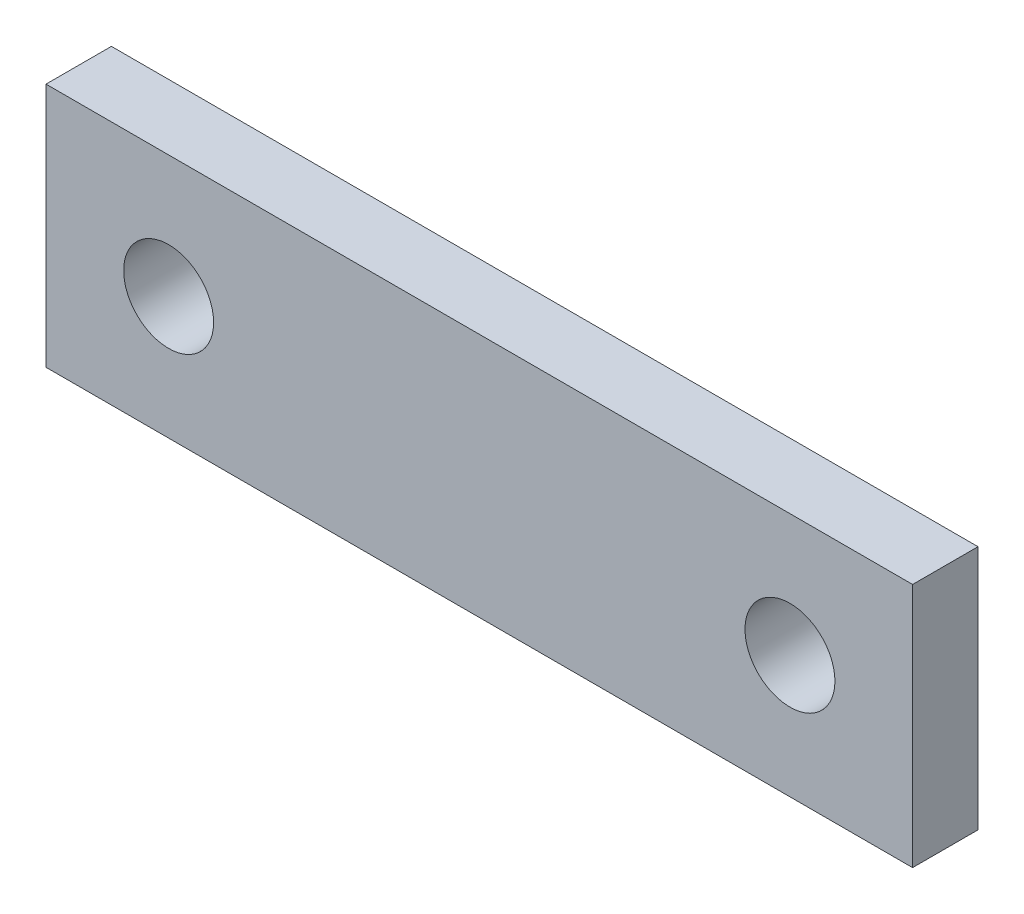
ISO-10303-21;
HEADER;
FILE_DESCRIPTION(('STEP AP214'),'2;1');
FILE_NAME('part.step','',(''),(''),'','','');
FILE_SCHEMA(('AUTOMOTIVE_DESIGN { 1 0 10303 214 1 1 1 1 }'));
ENDSEC;
DATA;
#1=APPLICATION_CONTEXT('core data for automotive mechanical design processes');
#2=APPLICATION_PROTOCOL_DEFINITION('international standard','automotive_design',2000,#1);
#3=PRODUCT_CONTEXT('',#1,'mechanical');
#4=PRODUCT('Part','Part','',(#3));
#5=PRODUCT_RELATED_PRODUCT_CATEGORY('part','',(#4));
#6=PRODUCT_DEFINITION_FORMATION('','',#4);
#7=PRODUCT_DEFINITION_CONTEXT('part definition',#1,'design');
#8=PRODUCT_DEFINITION('design','',#6,#7);
#9=PRODUCT_DEFINITION_SHAPE('','',#8);
#10=(LENGTH_UNIT() NAMED_UNIT(*) SI_UNIT(.MILLI.,.METRE.));
#11=(NAMED_UNIT(*) PLANE_ANGLE_UNIT() SI_UNIT($,.RADIAN.));
#12=(NAMED_UNIT(*) SI_UNIT($,.STERADIAN.) SOLID_ANGLE_UNIT());
#13=UNCERTAINTY_MEASURE_WITH_UNIT(LENGTH_MEASURE(1.E-05),#10,'distance_accuracy_value','');
#14=(GEOMETRIC_REPRESENTATION_CONTEXT(3) GLOBAL_UNCERTAINTY_ASSIGNED_CONTEXT((#13)) GLOBAL_UNIT_ASSIGNED_CONTEXT((#10,
#11,#12)) REPRESENTATION_CONTEXT('',''));
#15=CARTESIAN_POINT('',(0.,0.,0.));
#16=DIRECTION('',(0.,0.,1.));
#17=DIRECTION('',(1.,0.,0.));
#18=AXIS2_PLACEMENT_3D('',#15,#16,#17);
#19=CARTESIAN_POINT('',(0.,0.,16.));
#20=DIRECTION('',(1.,0.,0.));
#21=DIRECTION('',(0.,0.,-1.));
#22=AXIS2_PLACEMENT_3D('',#19,#20,#21);
#23=PLANE('',#22);
#24=DIRECTION('',(0.,-1.,0.));
#25=VECTOR('',#24,1.);
#26=CARTESIAN_POINT('',(0.,0.,0.));
#27=LINE('',#26,#25);
#28=CARTESIAN_POINT('',(0.,60.,0.));
#29=VERTEX_POINT('',#28);
#30=CARTESIAN_POINT('',(0.,0.,0.));
#31=VERTEX_POINT('',#30);
#32=EDGE_CURVE('E95',#29,#31,#27,.T.);
#33=ORIENTED_EDGE('',*,*,#32,.T.);
#34=DIRECTION('',(0.,0.,-1.));
#35=VECTOR('',#34,1.);
#36=CARTESIAN_POINT('',(0.,0.,16.));
#37=LINE('',#36,#35);
#38=CARTESIAN_POINT('',(0.,0.,16.));
#39=VERTEX_POINT('',#38);
#40=EDGE_CURVE('E11',#39,#31,#37,.T.);
#41=ORIENTED_EDGE('',*,*,#40,.F.);
#42=DIRECTION('',(0.,-1.,0.));
#43=VECTOR('',#42,1.);
#44=CARTESIAN_POINT('',(0.,0.,16.));
#45=LINE('',#44,#43);
#46=CARTESIAN_POINT('',(0.,60.,16.));
#47=VERTEX_POINT('',#46);
#48=EDGE_CURVE('E83',#47,#39,#45,.T.);
#49=ORIENTED_EDGE('',*,*,#48,.F.);
#50=DIRECTION('',(0.,0.,-1.));
#51=VECTOR('',#50,1.);
#52=CARTESIAN_POINT('',(0.,60.,16.));
#53=LINE('',#52,#51);
#54=EDGE_CURVE('E91',#47,#29,#53,.T.);
#55=ORIENTED_EDGE('',*,*,#54,.T.);
#56=EDGE_LOOP('',(#33,#41,#49,#55));
#57=FACE_BOUND('',#56,.T.);
#58=ADVANCED_FACE('F32',(#57),#23,.F.);
#59=CARTESIAN_POINT('',(0.,0.,16.));
#60=DIRECTION('',(0.,1.,0.));
#61=DIRECTION('',(0.,0.,1.));
#62=AXIS2_PLACEMENT_3D('',#59,#60,#61);
#63=PLANE('',#62);
#64=DIRECTION('',(1.,0.,0.));
#65=VECTOR('',#64,1.);
#66=CARTESIAN_POINT('',(0.,0.,0.));
#67=LINE('',#66,#65);
#68=CARTESIAN_POINT('',(212.,0.,0.));
#69=VERTEX_POINT('',#68);
#70=EDGE_CURVE('E87',#31,#69,#67,.T.);
#71=ORIENTED_EDGE('',*,*,#70,.T.);
#72=DIRECTION('',(0.,0.,-1.));
#73=VECTOR('',#72,1.);
#74=CARTESIAN_POINT('',(212.,0.,16.));
#75=LINE('',#74,#73);
#76=CARTESIAN_POINT('',(212.,0.,16.));
#77=VERTEX_POINT('',#76);
#78=EDGE_CURVE('E40',#77,#69,#75,.T.);
#79=ORIENTED_EDGE('',*,*,#78,.F.);
#80=DIRECTION('',(1.,0.,0.));
#81=VECTOR('',#80,1.);
#82=CARTESIAN_POINT('',(0.,0.,16.));
#83=LINE('',#82,#81);
#84=EDGE_CURVE('E78',#39,#77,#83,.T.);
#85=ORIENTED_EDGE('',*,*,#84,.F.);
#86=ORIENTED_EDGE('',*,*,#40,.T.);
#87=EDGE_LOOP('',(#71,#79,#85,#86));
#88=FACE_BOUND('',#87,.T.);
#89=ADVANCED_FACE('F86',(#88),#63,.F.);
#90=CARTESIAN_POINT('',(212.,0.,16.));
#91=DIRECTION('',(-1.,0.,0.));
#92=DIRECTION('',(0.,0.,1.));
#93=AXIS2_PLACEMENT_3D('',#90,#91,#92);
#94=PLANE('',#93);
#95=DIRECTION('',(0.,1.,0.));
#96=VECTOR('',#95,1.);
#97=CARTESIAN_POINT('',(212.,0.,0.));
#98=LINE('',#97,#96);
#99=CARTESIAN_POINT('',(212.,60.,0.));
#100=VERTEX_POINT('',#99);
#101=EDGE_CURVE('E65',#69,#100,#98,.T.);
#102=ORIENTED_EDGE('',*,*,#101,.T.);
#103=DIRECTION('',(0.,0.,-1.));
#104=VECTOR('',#103,1.);
#105=CARTESIAN_POINT('',(212.,60.,16.));
#106=LINE('',#105,#104);
#107=CARTESIAN_POINT('',(212.,60.,16.));
#108=VERTEX_POINT('',#107);
#109=EDGE_CURVE('E88',#108,#100,#106,.T.);
#110=ORIENTED_EDGE('',*,*,#109,.F.);
#111=DIRECTION('',(0.,1.,0.));
#112=VECTOR('',#111,1.);
#113=CARTESIAN_POINT('',(212.,0.,16.));
#114=LINE('',#113,#112);
#115=EDGE_CURVE('E81',#77,#108,#114,.T.);
#116=ORIENTED_EDGE('',*,*,#115,.F.);
#117=ORIENTED_EDGE('',*,*,#78,.T.);
#118=EDGE_LOOP('',(#102,#110,#116,#117));
#119=FACE_BOUND('',#118,.T.);
#120=ADVANCED_FACE('F89',(#119),#94,.F.);
#121=CARTESIAN_POINT('',(0.,60.,16.));
#122=DIRECTION('',(0.,-1.,0.));
#123=DIRECTION('',(0.,0.,-1.));
#124=AXIS2_PLACEMENT_3D('',#121,#122,#123);
#125=PLANE('',#124);
#126=DIRECTION('',(-1.,0.,0.));
#127=VECTOR('',#126,1.);
#128=CARTESIAN_POINT('',(0.,60.,0.));
#129=LINE('',#128,#127);
#130=EDGE_CURVE('E71',#100,#29,#129,.T.);
#131=ORIENTED_EDGE('',*,*,#130,.T.);
#132=ORIENTED_EDGE('',*,*,#54,.F.);
#133=DIRECTION('',(-1.,0.,0.));
#134=VECTOR('',#133,1.);
#135=CARTESIAN_POINT('',(0.,60.,16.));
#136=LINE('',#135,#134);
#137=EDGE_CURVE('E48',#108,#47,#136,.T.);
#138=ORIENTED_EDGE('',*,*,#137,.F.);
#139=ORIENTED_EDGE('',*,*,#109,.T.);
#140=EDGE_LOOP('',(#131,#132,#138,#139));
#141=FACE_BOUND('',#140,.T.);
#142=ADVANCED_FACE('F103',(#141),#125,.F.);
#143=CARTESIAN_POINT('',(0.,60.,16.));
#144=DIRECTION('',(0.,0.,-1.));
#145=DIRECTION('',(-1.,0.,0.));
#146=AXIS2_PLACEMENT_3D('',#143,#144,#145);
#147=PLANE('',#146);
#148=CARTESIAN_POINT('',(182.,30.,16.));
#149=DIRECTION('',(0.,0.,1.));
#150=DIRECTION('',(1.,0.,0.));
#151=AXIS2_PLACEMENT_3D('',#148,#149,#150);
#152=CIRCLE('',#151,11.);
#153=CARTESIAN_POINT('',(193.,30.,16.));
#154=VERTEX_POINT('',#153);
#155=EDGE_CURVE('E115',#154,#154,#152,.T.);
#156=ORIENTED_EDGE('',*,*,#155,.F.);
#157=EDGE_LOOP('',(#156));
#158=FACE_BOUND('',#157,.T.);
#159=CARTESIAN_POINT('',(30.,30.,16.));
#160=DIRECTION('',(0.,0.,1.));
#161=DIRECTION('',(1.,0.,0.));
#162=AXIS2_PLACEMENT_3D('',#159,#160,#161);
#163=CIRCLE('',#162,11.);
#164=CARTESIAN_POINT('',(41.,30.,16.));
#165=VERTEX_POINT('',#164);
#166=EDGE_CURVE('E109',#165,#165,#163,.T.);
#167=ORIENTED_EDGE('',*,*,#166,.F.);
#168=EDGE_LOOP('',(#167));
#169=FACE_BOUND('',#168,.T.);
#170=ORIENTED_EDGE('',*,*,#48,.T.);
#171=ORIENTED_EDGE('',*,*,#84,.T.);
#172=ORIENTED_EDGE('',*,*,#115,.T.);
#173=ORIENTED_EDGE('',*,*,#137,.T.);
#174=EDGE_LOOP('',(#170,#171,#172,#173));
#175=FACE_BOUND('',#174,.T.);
#176=ADVANCED_FACE('F79',(#158,#169,#175),#147,.F.);
#177=CARTESIAN_POINT('',(0.,60.,0.));
#178=DIRECTION('',(0.,0.,-1.));
#179=DIRECTION('',(-1.,0.,0.));
#180=AXIS2_PLACEMENT_3D('',#177,#178,#179);
#181=PLANE('',#180);
#182=CARTESIAN_POINT('',(182.,30.,0.));
#183=DIRECTION('',(0.,0.,1.));
#184=DIRECTION('',(1.,0.,0.));
#185=AXIS2_PLACEMENT_3D('',#182,#183,#184);
#186=CIRCLE('',#185,11.);
#187=CARTESIAN_POINT('',(193.,30.,0.));
#188=VERTEX_POINT('',#187);
#189=EDGE_CURVE('E112',#188,#188,#186,.T.);
#190=ORIENTED_EDGE('',*,*,#189,.T.);
#191=EDGE_LOOP('',(#190));
#192=FACE_BOUND('',#191,.T.);
#193=CARTESIAN_POINT('',(30.,30.,0.));
#194=DIRECTION('',(0.,0.,1.));
#195=DIRECTION('',(1.,0.,0.));
#196=AXIS2_PLACEMENT_3D('',#193,#194,#195);
#197=CIRCLE('',#196,11.);
#198=CARTESIAN_POINT('',(41.,30.,0.));
#199=VERTEX_POINT('',#198);
#200=EDGE_CURVE('E98',#199,#199,#197,.T.);
#201=ORIENTED_EDGE('',*,*,#200,.T.);
#202=EDGE_LOOP('',(#201));
#203=FACE_BOUND('',#202,.T.);
#204=ORIENTED_EDGE('',*,*,#32,.F.);
#205=ORIENTED_EDGE('',*,*,#130,.F.);
#206=ORIENTED_EDGE('',*,*,#101,.F.);
#207=ORIENTED_EDGE('',*,*,#70,.F.);
#208=EDGE_LOOP('',(#204,#205,#206,#207));
#209=FACE_BOUND('',#208,.T.);
#210=ADVANCED_FACE('F106',(#192,#203,#209),#181,.T.);
#211=CARTESIAN_POINT('',(30.,30.,0.));
#212=DIRECTION('',(0.,0.,1.));
#213=DIRECTION('',(1.,0.,0.));
#214=AXIS2_PLACEMENT_3D('',#211,#212,#213);
#215=CYLINDRICAL_SURFACE('',#214,11.);
#216=ORIENTED_EDGE('',*,*,#200,.F.);
#217=EDGE_LOOP('',(#216));
#218=FACE_BOUND('',#217,.T.);
#219=ORIENTED_EDGE('',*,*,#166,.T.);
#220=EDGE_LOOP('',(#219));
#221=FACE_BOUND('',#220,.T.);
#222=ADVANCED_FACE('F126',(#218,#221),#215,.F.);
#223=CARTESIAN_POINT('',(182.,30.,0.));
#224=DIRECTION('',(0.,0.,1.));
#225=DIRECTION('',(1.,0.,0.));
#226=AXIS2_PLACEMENT_3D('',#223,#224,#225);
#227=CYLINDRICAL_SURFACE('',#226,11.);
#228=ORIENTED_EDGE('',*,*,#189,.F.);
#229=EDGE_LOOP('',(#228));
#230=FACE_BOUND('',#229,.T.);
#231=ORIENTED_EDGE('',*,*,#155,.T.);
#232=EDGE_LOOP('',(#231));
#233=FACE_BOUND('',#232,.T.);
#234=ADVANCED_FACE('F123',(#230,#233),#227,.F.);
#235=CLOSED_SHELL('',(#58,#89,#120,#142,#176,#210,#222,#234));
#236=MANIFOLD_SOLID_BREP('B2',#235);
#237=ADVANCED_BREP_SHAPE_REPRESENTATION('',(#18,#236),#14);
#238=SHAPE_DEFINITION_REPRESENTATION(#9,#237);
ENDSEC;
END-ISO-10303-21;
